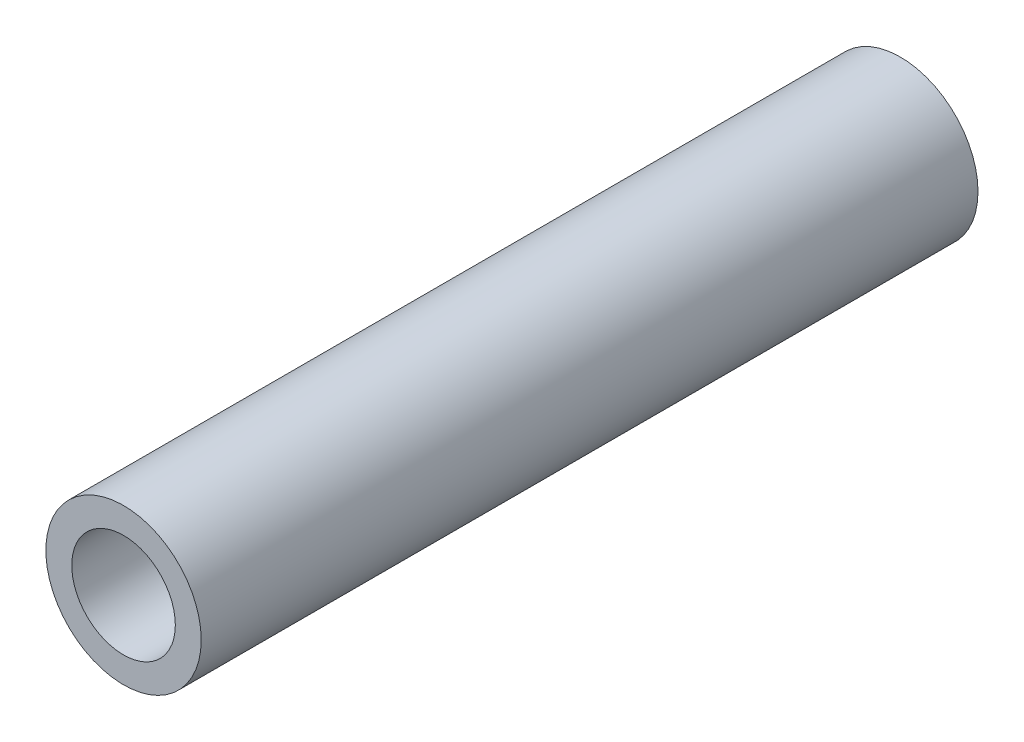
ISO-10303-21;
HEADER;
FILE_DESCRIPTION(('STEP AP214'),'2;1');
FILE_NAME('part.step','',(''),(''),'','','');
FILE_SCHEMA(('AUTOMOTIVE_DESIGN { 1 0 10303 214 1 1 1 1 }'));
ENDSEC;
DATA;
#1=APPLICATION_CONTEXT('core data for automotive mechanical design processes');
#2=APPLICATION_PROTOCOL_DEFINITION('international standard','automotive_design',2000,#1);
#3=PRODUCT_CONTEXT('',#1,'mechanical');
#4=PRODUCT('Part','Part','',(#3));
#5=PRODUCT_RELATED_PRODUCT_CATEGORY('part','',(#4));
#6=PRODUCT_DEFINITION_FORMATION('','',#4);
#7=PRODUCT_DEFINITION_CONTEXT('part definition',#1,'design');
#8=PRODUCT_DEFINITION('design','',#6,#7);
#9=PRODUCT_DEFINITION_SHAPE('','',#8);
#10=(LENGTH_UNIT() NAMED_UNIT(*) SI_UNIT(.MILLI.,.METRE.));
#11=(NAMED_UNIT(*) PLANE_ANGLE_UNIT() SI_UNIT($,.RADIAN.));
#12=(NAMED_UNIT(*) SI_UNIT($,.STERADIAN.) SOLID_ANGLE_UNIT());
#13=UNCERTAINTY_MEASURE_WITH_UNIT(LENGTH_MEASURE(1.E-05),#10,'distance_accuracy_value','');
#14=(GEOMETRIC_REPRESENTATION_CONTEXT(3) GLOBAL_UNCERTAINTY_ASSIGNED_CONTEXT((#13)) GLOBAL_UNIT_ASSIGNED_CONTEXT((#10,
#11,#12)) REPRESENTATION_CONTEXT('',''));
#15=CARTESIAN_POINT('',(0.,0.,0.));
#16=DIRECTION('',(0.,0.,1.));
#17=DIRECTION('',(1.,0.,0.));
#18=AXIS2_PLACEMENT_3D('',#15,#16,#17);
#19=CARTESIAN_POINT('',(0.,0.,15.));
#20=DIRECTION('',(0.,0.,1.));
#21=DIRECTION('',(1.,0.,0.));
#22=AXIS2_PLACEMENT_3D('',#19,#20,#21);
#23=PLANE('',#22);
#24=CARTESIAN_POINT('',(0.,0.,15.));
#25=DIRECTION('',(0.,0.,1.));
#26=DIRECTION('',(1.,0.,0.));
#27=AXIS2_PLACEMENT_3D('',#24,#25,#26);
#28=CIRCLE('',#27,3.);
#29=CARTESIAN_POINT('',(3.,0.,15.));
#30=VERTEX_POINT('',#29);
#31=EDGE_CURVE('E10',#30,#30,#28,.T.);
#32=ORIENTED_EDGE('',*,*,#31,.T.);
#33=EDGE_LOOP('',(#32));
#34=FACE_BOUND('',#33,.T.);
#35=CARTESIAN_POINT('',(0.,0.,15.));
#36=DIRECTION('',(0.,0.,1.));
#37=DIRECTION('',(1.,0.,0.));
#38=AXIS2_PLACEMENT_3D('',#35,#36,#37);
#39=CIRCLE('',#38,2.);
#40=CARTESIAN_POINT('',(2.,0.,15.));
#41=VERTEX_POINT('',#40);
#42=EDGE_CURVE('E42',#41,#41,#39,.T.);
#43=ORIENTED_EDGE('',*,*,#42,.F.);
#44=EDGE_LOOP('',(#43));
#45=FACE_BOUND('',#44,.T.);
#46=ADVANCED_FACE('F31',(#34,#45),#23,.T.);
#47=CARTESIAN_POINT('',(0.,0.,-15.));
#48=DIRECTION('',(0.,0.,1.));
#49=DIRECTION('',(1.,0.,0.));
#50=AXIS2_PLACEMENT_3D('',#47,#48,#49);
#51=PLANE('',#50);
#52=CARTESIAN_POINT('',(0.,0.,-15.));
#53=DIRECTION('',(0.,0.,1.));
#54=DIRECTION('',(1.,0.,0.));
#55=AXIS2_PLACEMENT_3D('',#52,#53,#54);
#56=CIRCLE('',#55,3.);
#57=CARTESIAN_POINT('',(3.,0.,-15.));
#58=VERTEX_POINT('',#57);
#59=EDGE_CURVE('E35',#58,#58,#56,.T.);
#60=ORIENTED_EDGE('',*,*,#59,.F.);
#61=EDGE_LOOP('',(#60));
#62=FACE_BOUND('',#61,.T.);
#63=CARTESIAN_POINT('',(0.,0.,-15.));
#64=DIRECTION('',(0.,0.,1.));
#65=DIRECTION('',(1.,0.,0.));
#66=AXIS2_PLACEMENT_3D('',#63,#64,#65);
#67=CIRCLE('',#66,2.);
#68=CARTESIAN_POINT('',(2.,0.,-15.));
#69=VERTEX_POINT('',#68);
#70=EDGE_CURVE('E44',#69,#69,#67,.T.);
#71=ORIENTED_EDGE('',*,*,#70,.T.);
#72=EDGE_LOOP('',(#71));
#73=FACE_BOUND('',#72,.T.);
#74=ADVANCED_FACE('F54',(#62,#73),#51,.F.);
#75=CARTESIAN_POINT('',(0.,0.,15.));
#76=DIRECTION('',(0.,0.,-1.));
#77=DIRECTION('',(-1.,0.,0.));
#78=AXIS2_PLACEMENT_3D('',#75,#76,#77);
#79=CYLINDRICAL_SURFACE('',#78,3.);
#80=ORIENTED_EDGE('',*,*,#31,.F.);
#81=EDGE_LOOP('',(#80));
#82=FACE_BOUND('',#81,.T.);
#83=ORIENTED_EDGE('',*,*,#59,.T.);
#84=EDGE_LOOP('',(#83));
#85=FACE_BOUND('',#84,.T.);
#86=ADVANCED_FACE('F33',(#82,#85),#79,.T.);
#87=CARTESIAN_POINT('',(0.,0.,15.));
#88=DIRECTION('',(0.,0.,-1.));
#89=DIRECTION('',(-1.,0.,0.));
#90=AXIS2_PLACEMENT_3D('',#87,#88,#89);
#91=CYLINDRICAL_SURFACE('',#90,2.);
#92=ORIENTED_EDGE('',*,*,#42,.T.);
#93=EDGE_LOOP('',(#92));
#94=FACE_BOUND('',#93,.T.);
#95=ORIENTED_EDGE('',*,*,#70,.F.);
#96=EDGE_LOOP('',(#95));
#97=FACE_BOUND('',#96,.T.);
#98=ADVANCED_FACE('F50',(#94,#97),#91,.F.);
#99=CLOSED_SHELL('',(#46,#74,#86,#98));
#100=MANIFOLD_SOLID_BREP('B2',#99);
#101=ADVANCED_BREP_SHAPE_REPRESENTATION('',(#18,#100),#14);
#102=SHAPE_DEFINITION_REPRESENTATION(#9,#101);
ENDSEC;
END-ISO-10303-21;
